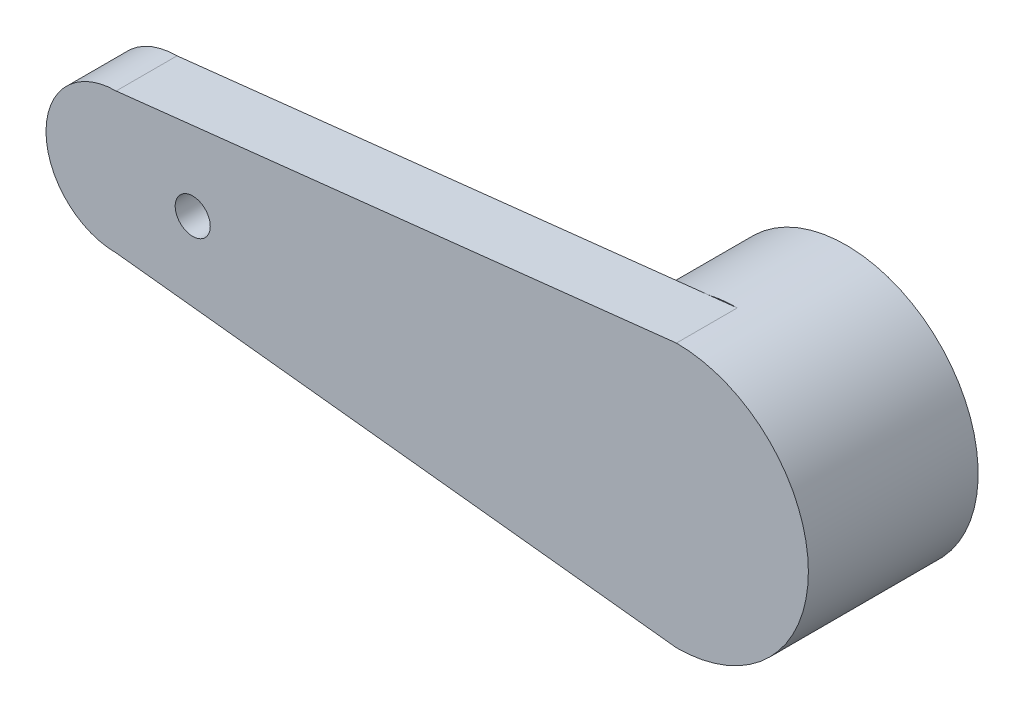
ISO-10303-21;
HEADER;
FILE_DESCRIPTION(('STEP AP214'),'2;1');
FILE_NAME('part.step','',(''),(''),'','','');
FILE_SCHEMA(('AUTOMOTIVE_DESIGN { 1 0 10303 214 1 1 1 1 }'));
ENDSEC;
DATA;
#1=APPLICATION_CONTEXT('core data for automotive mechanical design processes');
#2=APPLICATION_PROTOCOL_DEFINITION('international standard','automotive_design',2000,#1);
#3=PRODUCT_CONTEXT('',#1,'mechanical');
#4=PRODUCT('Part','Part','',(#3));
#5=PRODUCT_RELATED_PRODUCT_CATEGORY('part','',(#4));
#6=PRODUCT_DEFINITION_FORMATION('','',#4);
#7=PRODUCT_DEFINITION_CONTEXT('part definition',#1,'design');
#8=PRODUCT_DEFINITION('design','',#6,#7);
#9=PRODUCT_DEFINITION_SHAPE('','',#8);
#10=(LENGTH_UNIT() NAMED_UNIT(*) SI_UNIT(.MILLI.,.METRE.));
#11=(NAMED_UNIT(*) PLANE_ANGLE_UNIT() SI_UNIT($,.RADIAN.));
#12=(NAMED_UNIT(*) SI_UNIT($,.STERADIAN.) SOLID_ANGLE_UNIT());
#13=UNCERTAINTY_MEASURE_WITH_UNIT(LENGTH_MEASURE(1.E-05),#10,'distance_accuracy_value','');
#14=(GEOMETRIC_REPRESENTATION_CONTEXT(3) GLOBAL_UNCERTAINTY_ASSIGNED_CONTEXT((#13)) GLOBAL_UNIT_ASSIGNED_CONTEXT((#10,
#11,#12)) REPRESENTATION_CONTEXT('',''));
#15=CARTESIAN_POINT('',(0.,0.,0.));
#16=DIRECTION('',(0.,0.,1.));
#17=DIRECTION('',(1.,0.,0.));
#18=AXIS2_PLACEMENT_3D('',#15,#16,#17);
#19=CARTESIAN_POINT('',(-15.1787522190543,0.,0.));
#20=DIRECTION('',(0.,0.,1.));
#21=DIRECTION('',(1.,0.,0.));
#22=AXIS2_PLACEMENT_3D('',#19,#20,#21);
#23=PLANE('',#22);
#24=CARTESIAN_POINT('',(-13.1037522190543,0.,0.));
#25=DIRECTION('',(0.,0.,1.));
#26=DIRECTION('',(1.,0.,0.));
#27=AXIS2_PLACEMENT_3D('',#24,#25,#26);
#28=CIRCLE('',#27,0.475);
#29=CARTESIAN_POINT('',(-12.6287522190543,0.,0.));
#30=VERTEX_POINT('',#29);
#31=EDGE_CURVE('E171',#30,#30,#28,.F.);
#32=ORIENTED_EDGE('',*,*,#31,.F.);
#33=EDGE_LOOP('',(#32));
#34=FACE_BOUND('',#33,.T.);
#35=CARTESIAN_POINT('',(0.,0.,0.));
#36=DIRECTION('',(0.,0.,-1.));
#37=DIRECTION('',(-1.,0.,0.));
#38=AXIS2_PLACEMENT_3D('',#35,#36,#37);
#39=CIRCLE('',#38,3.575);
#40=CARTESIAN_POINT('',(-0.779521522593947,-3.48897853186471,0.));
#41=VERTEX_POINT('',#40);
#42=CARTESIAN_POINT('',(-0.779521522593947,3.48897853186471,0.));
#43=VERTEX_POINT('',#42);
#44=EDGE_CURVE('E11',#41,#43,#39,.T.);
#45=ORIENTED_EDGE('',*,*,#44,.F.);
#46=DIRECTION('',(0.993966310010366,-0.109685799283118,0.));
#47=VECTOR('',#46,1.);
#48=CARTESIAN_POINT('',(-15.1787522190543,-1.9,0.));
#49=LINE('',#48,#47);
#50=CARTESIAN_POINT('',(-15.1787522190543,-1.9,0.));
#51=VERTEX_POINT('',#50);
#52=EDGE_CURVE('E97',#51,#41,#49,.T.);
#53=ORIENTED_EDGE('',*,*,#52,.F.);
#54=CARTESIAN_POINT('',(-15.1787522190543,0.,0.));
#55=DIRECTION('',(0.,0.,1.));
#56=DIRECTION('',(1.,0.,0.));
#57=AXIS2_PLACEMENT_3D('',#54,#55,#56);
#58=CIRCLE('',#57,1.9);
#59=CARTESIAN_POINT('',(-15.1787522190543,1.9,0.));
#60=VERTEX_POINT('',#59);
#61=EDGE_CURVE('E96',#60,#51,#58,.T.);
#62=ORIENTED_EDGE('',*,*,#61,.F.);
#63=DIRECTION('',(-0.993966310010366,-0.109685799283118,0.));
#64=VECTOR('',#63,1.);
#65=CARTESIAN_POINT('',(-15.1787522190543,1.9,0.));
#66=LINE('',#65,#64);
#67=EDGE_CURVE('E76',#43,#60,#66,.T.);
#68=ORIENTED_EDGE('',*,*,#67,.F.);
#69=EDGE_LOOP('',(#45,#53,#62,#68));
#70=FACE_BOUND('',#69,.T.);
#71=ADVANCED_FACE('F32',(#34,#70),#23,.F.);
#72=CARTESIAN_POINT('',(-15.1787522190543,0.,1.65));
#73=DIRECTION('',(0.,0.,-1.));
#74=DIRECTION('',(-1.,0.,0.));
#75=AXIS2_PLACEMENT_3D('',#72,#73,#74);
#76=CYLINDRICAL_SURFACE('',#75,1.9);
#77=ORIENTED_EDGE('',*,*,#61,.T.);
#78=DIRECTION('',(0.,0.,-1.));
#79=VECTOR('',#78,1.);
#80=CARTESIAN_POINT('',(-15.1787522190543,-1.9,1.65));
#81=LINE('',#80,#79);
#82=CARTESIAN_POINT('',(-15.1787522190543,-1.9,1.65));
#83=VERTEX_POINT('',#82);
#84=EDGE_CURVE('E42',#83,#51,#81,.T.);
#85=ORIENTED_EDGE('',*,*,#84,.F.);
#86=CARTESIAN_POINT('',(-15.1787522190543,0.,1.65));
#87=DIRECTION('',(0.,0.,1.));
#88=DIRECTION('',(1.,0.,0.));
#89=AXIS2_PLACEMENT_3D('',#86,#87,#88);
#90=CIRCLE('',#89,1.9);
#91=CARTESIAN_POINT('',(-15.1787522190543,1.9,1.65));
#92=VERTEX_POINT('',#91);
#93=EDGE_CURVE('E93',#92,#83,#90,.T.);
#94=ORIENTED_EDGE('',*,*,#93,.F.);
#95=DIRECTION('',(0.,0.,-1.));
#96=VECTOR('',#95,1.);
#97=CARTESIAN_POINT('',(-15.1787522190543,1.9,1.65));
#98=LINE('',#97,#96);
#99=EDGE_CURVE('E129',#92,#60,#98,.T.);
#100=ORIENTED_EDGE('',*,*,#99,.T.);
#101=EDGE_LOOP('',(#77,#85,#94,#100));
#102=FACE_BOUND('',#101,.T.);
#103=ADVANCED_FACE('F34',(#102),#76,.T.);
#104=CARTESIAN_POINT('',(-15.1787522190543,-1.9,1.65));
#105=DIRECTION('',(0.109685799283118,0.993966310010366,0.));
#106=DIRECTION('',(-0.993966310010366,0.109685799283118,0.));
#107=AXIS2_PLACEMENT_3D('',#104,#105,#106);
#108=PLANE('',#107);
#109=ORIENTED_EDGE('',*,*,#52,.T.);
#110=CARTESIAN_POINT('',(0.,-3.575,0.));
#111=VERTEX_POINT('',#110);
#112=EDGE_CURVE('E119',#41,#111,#49,.T.);
#113=ORIENTED_EDGE('',*,*,#112,.T.);
#114=DIRECTION('',(0.,0.,-1.));
#115=VECTOR('',#114,1.);
#116=CARTESIAN_POINT('',(0.,-3.575,1.65));
#117=LINE('',#116,#115);
#118=CARTESIAN_POINT('',(0.,-3.575,1.65));
#119=VERTEX_POINT('',#118);
#120=EDGE_CURVE('E123',#119,#111,#117,.T.);
#121=ORIENTED_EDGE('',*,*,#120,.F.);
#122=DIRECTION('',(0.993966310010366,-0.109685799283118,0.));
#123=VECTOR('',#122,1.);
#124=CARTESIAN_POINT('',(-15.1787522190543,-1.9,1.65));
#125=LINE('',#124,#123);
#126=EDGE_CURVE('E84',#83,#119,#125,.T.);
#127=ORIENTED_EDGE('',*,*,#126,.F.);
#128=ORIENTED_EDGE('',*,*,#84,.T.);
#129=EDGE_LOOP('',(#109,#113,#121,#127,#128));
#130=FACE_BOUND('',#129,.T.);
#131=ADVANCED_FACE('F142',(#130),#108,.F.);
#132=CARTESIAN_POINT('',(0.,0.,1.65));
#133=DIRECTION('',(0.,0.,-1.));
#134=DIRECTION('',(-1.,0.,0.));
#135=AXIS2_PLACEMENT_3D('',#132,#133,#134);
#136=CYLINDRICAL_SURFACE('',#135,3.575);
#137=ORIENTED_EDGE('',*,*,#120,.T.);
#138=EDGE_CURVE('E105',#111,#41,#39,.T.);
#139=ORIENTED_EDGE('',*,*,#138,.T.);
#140=ORIENTED_EDGE('',*,*,#44,.T.);
#141=CARTESIAN_POINT('',(0.,3.575,0.));
#142=VERTEX_POINT('',#141);
#143=EDGE_CURVE('E103',#43,#142,#39,.T.);
#144=ORIENTED_EDGE('',*,*,#143,.T.);
#145=DIRECTION('',(0.,0.,-1.));
#146=VECTOR('',#145,1.);
#147=CARTESIAN_POINT('',(0.,3.575,1.65));
#148=LINE('',#147,#146);
#149=CARTESIAN_POINT('',(0.,3.575,1.65));
#150=VERTEX_POINT('',#149);
#151=EDGE_CURVE('E89',#150,#142,#148,.T.);
#152=ORIENTED_EDGE('',*,*,#151,.F.);
#153=CARTESIAN_POINT('',(0.,0.,1.65));
#154=DIRECTION('',(0.,0.,1.));
#155=DIRECTION('',(1.,0.,0.));
#156=AXIS2_PLACEMENT_3D('',#153,#154,#155);
#157=CIRCLE('',#156,3.575);
#158=EDGE_CURVE('E133',#119,#150,#157,.T.);
#159=ORIENTED_EDGE('',*,*,#158,.F.);
#160=EDGE_LOOP('',(#137,#139,#140,#144,#152,#159));
#161=FACE_BOUND('',#160,.T.);
#162=CARTESIAN_POINT('',(0.,0.,-2.95));
#163=DIRECTION('',(0.,0.,-1.));
#164=DIRECTION('',(-1.,0.,0.));
#165=AXIS2_PLACEMENT_3D('',#162,#163,#164);
#166=CIRCLE('',#165,3.575);
#167=CARTESIAN_POINT('',(-3.575,0.,-2.95));
#168=VERTEX_POINT('',#167);
#169=EDGE_CURVE('E107',#168,#168,#166,.T.);
#170=ORIENTED_EDGE('',*,*,#169,.F.);
#171=EDGE_LOOP('',(#170));
#172=FACE_BOUND('',#171,.T.);
#173=ADVANCED_FACE('F101',(#161,#172),#136,.T.);
#174=CARTESIAN_POINT('',(-15.1787522190543,1.9,1.65));
#175=DIRECTION('',(0.109685799283118,-0.993966310010366,0.));
#176=DIRECTION('',(0.993966310010366,0.109685799283118,0.));
#177=AXIS2_PLACEMENT_3D('',#174,#175,#176);
#178=PLANE('',#177);
#179=EDGE_CURVE('E36',#142,#43,#66,.T.);
#180=ORIENTED_EDGE('',*,*,#179,.T.);
#181=ORIENTED_EDGE('',*,*,#67,.T.);
#182=ORIENTED_EDGE('',*,*,#99,.F.);
#183=DIRECTION('',(-0.993966310010366,-0.109685799283118,0.));
#184=VECTOR('',#183,1.);
#185=CARTESIAN_POINT('',(-15.1787522190543,1.9,1.65));
#186=LINE('',#185,#184);
#187=EDGE_CURVE('E57',#150,#92,#186,.T.);
#188=ORIENTED_EDGE('',*,*,#187,.F.);
#189=ORIENTED_EDGE('',*,*,#151,.T.);
#190=EDGE_LOOP('',(#180,#181,#182,#188,#189));
#191=FACE_BOUND('',#190,.T.);
#192=ADVANCED_FACE('F87',(#191),#178,.F.);
#193=CARTESIAN_POINT('',(-15.1787522190543,0.,1.65));
#194=DIRECTION('',(0.,0.,1.));
#195=DIRECTION('',(1.,0.,0.));
#196=AXIS2_PLACEMENT_3D('',#193,#194,#195);
#197=PLANE('',#196);
#198=CARTESIAN_POINT('',(-13.1037522190543,0.,1.65));
#199=DIRECTION('',(0.,0.,1.));
#200=DIRECTION('',(1.,0.,0.));
#201=AXIS2_PLACEMENT_3D('',#198,#199,#200);
#202=CIRCLE('',#201,0.475);
#203=CARTESIAN_POINT('',(-12.6287522190543,0.,1.65));
#204=VERTEX_POINT('',#203);
#205=EDGE_CURVE('E169',#204,#204,#202,.T.);
#206=ORIENTED_EDGE('',*,*,#205,.F.);
#207=EDGE_LOOP('',(#206));
#208=FACE_BOUND('',#207,.T.);
#209=ORIENTED_EDGE('',*,*,#93,.T.);
#210=ORIENTED_EDGE('',*,*,#126,.T.);
#211=ORIENTED_EDGE('',*,*,#158,.T.);
#212=ORIENTED_EDGE('',*,*,#187,.T.);
#213=EDGE_LOOP('',(#209,#210,#211,#212));
#214=FACE_BOUND('',#213,.T.);
#215=ADVANCED_FACE('F137',(#208,#214),#197,.T.);
#216=CARTESIAN_POINT('',(0.,0.,0.));
#217=DIRECTION('',(0.,0.,-1.));
#218=DIRECTION('',(-1.,0.,0.));
#219=AXIS2_PLACEMENT_3D('',#216,#217,#218);
#220=PLANE('',#219);
#221=ORIENTED_EDGE('',*,*,#179,.F.);
#222=ORIENTED_EDGE('',*,*,#143,.F.);
#223=EDGE_LOOP('',(#221,#222));
#224=FACE_BOUND('',#223,.T.);
#225=ADVANCED_FACE('F106',(#224),#220,.F.);
#226=CARTESIAN_POINT('',(0.,0.,-2.95));
#227=DIRECTION('',(0.,0.,-1.));
#228=DIRECTION('',(-1.,0.,0.));
#229=AXIS2_PLACEMENT_3D('',#226,#227,#228);
#230=PLANE('',#229);
#231=CARTESIAN_POINT('',(0.,0.,-2.95));
#232=DIRECTION('',(0.,0.,-1.));
#233=DIRECTION('',(-1.,0.,0.));
#234=AXIS2_PLACEMENT_3D('',#231,#232,#233);
#235=CIRCLE('',#234,2.3);
#236=CARTESIAN_POINT('',(-2.3,0.,-2.95));
#237=VERTEX_POINT('',#236);
#238=EDGE_CURVE('E174',#237,#237,#235,.T.);
#239=ORIENTED_EDGE('',*,*,#238,.F.);
#240=EDGE_LOOP('',(#239));
#241=FACE_BOUND('',#240,.T.);
#242=ORIENTED_EDGE('',*,*,#169,.T.);
#243=EDGE_LOOP('',(#242));
#244=FACE_BOUND('',#243,.T.);
#245=ADVANCED_FACE('F166',(#241,#244),#230,.T.);
#246=ORIENTED_EDGE('',*,*,#112,.F.);
#247=ORIENTED_EDGE('',*,*,#138,.F.);
#248=EDGE_LOOP('',(#246,#247));
#249=FACE_BOUND('',#248,.T.);
#250=ADVANCED_FACE('F141',(#249),#220,.F.);
#251=CARTESIAN_POINT('',(0.,0.,0.));
#252=DIRECTION('',(0.,0.,-1.));
#253=DIRECTION('',(-1.,0.,0.));
#254=AXIS2_PLACEMENT_3D('',#251,#252,#253);
#255=CYLINDRICAL_SURFACE('',#254,2.3);
#256=CARTESIAN_POINT('',(0.,0.,0.));
#257=DIRECTION('',(0.,0.,-1.));
#258=DIRECTION('',(-1.,0.,0.));
#259=AXIS2_PLACEMENT_3D('',#256,#257,#258);
#260=CIRCLE('',#259,2.3);
#261=CARTESIAN_POINT('',(-2.3,0.,0.));
#262=VERTEX_POINT('',#261);
#263=EDGE_CURVE('E111',#262,#262,#260,.T.);
#264=ORIENTED_EDGE('',*,*,#263,.F.);
#265=EDGE_LOOP('',(#264));
#266=FACE_BOUND('',#265,.T.);
#267=ORIENTED_EDGE('',*,*,#238,.T.);
#268=EDGE_LOOP('',(#267));
#269=FACE_BOUND('',#268,.T.);
#270=ADVANCED_FACE('F181',(#266,#269),#255,.F.);
#271=CARTESIAN_POINT('',(0.,0.,0.));
#272=DIRECTION('',(0.,0.,-1.));
#273=DIRECTION('',(-1.,0.,0.));
#274=AXIS2_PLACEMENT_3D('',#271,#272,#273);
#275=PLANE('',#274);
#276=ORIENTED_EDGE('',*,*,#263,.T.);
#277=EDGE_LOOP('',(#276));
#278=FACE_BOUND('',#277,.T.);
#279=ADVANCED_FACE('F193',(#278),#275,.T.);
#280=CARTESIAN_POINT('',(-13.1037522190543,0.,-1.34350288425444));
#281=DIRECTION('',(0.,0.,1.));
#282=DIRECTION('',(1.,0.,0.));
#283=AXIS2_PLACEMENT_3D('',#280,#281,#282);
#284=CYLINDRICAL_SURFACE('',#283,0.475);
#285=ORIENTED_EDGE('',*,*,#31,.T.);
#286=EDGE_LOOP('',(#285));
#287=FACE_BOUND('',#286,.T.);
#288=ORIENTED_EDGE('',*,*,#205,.T.);
#289=EDGE_LOOP('',(#288));
#290=FACE_BOUND('',#289,.T.);
#291=ADVANCED_FACE('F197',(#287,#290),#284,.F.);
#292=CLOSED_SHELL('',(#71,#103,#131,#173,#192,#215,#225,#245,#250,#270,#279,#291));
#293=MANIFOLD_SOLID_BREP('B2',#292);
#294=ADVANCED_BREP_SHAPE_REPRESENTATION('',(#18,#293),#14);
#295=SHAPE_DEFINITION_REPRESENTATION(#9,#294);
ENDSEC;
END-ISO-10303-21;
